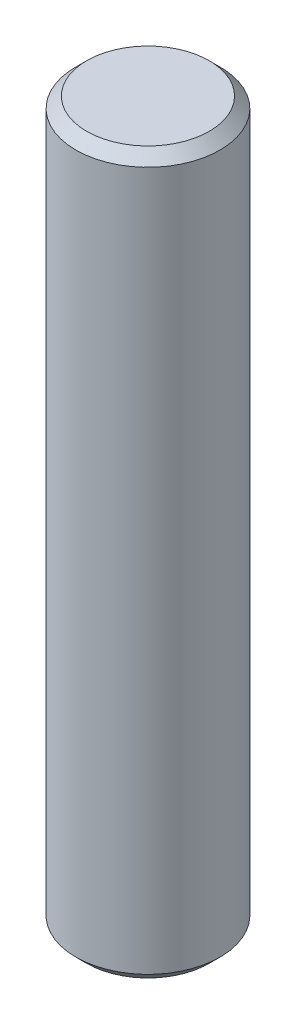
ISO-10303-21;
HEADER;
FILE_DESCRIPTION(('STEP AP214'),'2;1');
FILE_NAME('part.step','',(''),(''),'','','');
FILE_SCHEMA(('AUTOMOTIVE_DESIGN { 1 0 10303 214 1 1 1 1 }'));
ENDSEC;
DATA;
#1=APPLICATION_CONTEXT('core data for automotive mechanical design processes');
#2=APPLICATION_PROTOCOL_DEFINITION('international standard','automotive_design',2000,#1);
#3=PRODUCT_CONTEXT('',#1,'mechanical');
#4=PRODUCT('Part','Part','',(#3));
#5=PRODUCT_RELATED_PRODUCT_CATEGORY('part','',(#4));
#6=PRODUCT_DEFINITION_FORMATION('','',#4);
#7=PRODUCT_DEFINITION_CONTEXT('part definition',#1,'design');
#8=PRODUCT_DEFINITION('design','',#6,#7);
#9=PRODUCT_DEFINITION_SHAPE('','',#8);
#10=(LENGTH_UNIT() NAMED_UNIT(*) SI_UNIT(.MILLI.,.METRE.));
#11=(NAMED_UNIT(*) PLANE_ANGLE_UNIT() SI_UNIT($,.RADIAN.));
#12=(NAMED_UNIT(*) SI_UNIT($,.STERADIAN.) SOLID_ANGLE_UNIT());
#13=UNCERTAINTY_MEASURE_WITH_UNIT(LENGTH_MEASURE(1.E-05),#10,'distance_accuracy_value','');
#14=(GEOMETRIC_REPRESENTATION_CONTEXT(3) GLOBAL_UNCERTAINTY_ASSIGNED_CONTEXT((#13)) GLOBAL_UNIT_ASSIGNED_CONTEXT((#10,
#11,#12)) REPRESENTATION_CONTEXT('',''));
#15=CARTESIAN_POINT('',(0.,0.,0.));
#16=DIRECTION('',(0.,0.,1.));
#17=DIRECTION('',(1.,0.,0.));
#18=AXIS2_PLACEMENT_3D('',#15,#16,#17);
#19=CARTESIAN_POINT('',(0.,10.,0.));
#20=DIRECTION('',(0.,-1.,0.));
#21=DIRECTION('',(0.,0.,-1.));
#22=AXIS2_PLACEMENT_3D('',#19,#20,#21);
#23=CYLINDRICAL_SURFACE('',#22,2.);
#24=CARTESIAN_POINT('',(0.,-9.7,0.));
#25=DIRECTION('',(0.,1.,0.));
#26=DIRECTION('',(0.,0.,1.));
#27=AXIS2_PLACEMENT_3D('',#24,#25,#26);
#28=CIRCLE('',#27,2.);
#29=CARTESIAN_POINT('',(0.,-9.7,2.));
#30=VERTEX_POINT('',#29);
#31=EDGE_CURVE('E47',#30,#30,#28,.T.);
#32=ORIENTED_EDGE('',*,*,#31,.T.);
#33=EDGE_LOOP('',(#32));
#34=FACE_BOUND('',#33,.T.);
#35=CARTESIAN_POINT('',(0.,9.7,0.));
#36=DIRECTION('',(0.,1.,0.));
#37=DIRECTION('',(0.,0.,1.));
#38=AXIS2_PLACEMENT_3D('',#35,#36,#37);
#39=CIRCLE('',#38,2.);
#40=CARTESIAN_POINT('',(0.,9.7,2.));
#41=VERTEX_POINT('',#40);
#42=EDGE_CURVE('E51',#41,#41,#39,.F.);
#43=ORIENTED_EDGE('',*,*,#42,.T.);
#44=EDGE_LOOP('',(#43));
#45=FACE_BOUND('',#44,.T.);
#46=ADVANCED_FACE('F35',(#34,#45),#23,.T.);
#47=CARTESIAN_POINT('',(0.,10.,0.));
#48=DIRECTION('',(0.,1.,0.));
#49=DIRECTION('',(0.,0.,1.));
#50=AXIS2_PLACEMENT_3D('',#47,#48,#49);
#51=PLANE('',#50);
#52=CARTESIAN_POINT('',(0.,10.,0.));
#53=DIRECTION('',(0.,1.,0.));
#54=DIRECTION('',(0.,0.,1.));
#55=AXIS2_PLACEMENT_3D('',#52,#53,#54);
#56=CIRCLE('',#55,1.7);
#57=CARTESIAN_POINT('',(0.,10.,1.7));
#58=VERTEX_POINT('',#57);
#59=EDGE_CURVE('E10',#58,#58,#56,.T.);
#60=ORIENTED_EDGE('',*,*,#59,.T.);
#61=EDGE_LOOP('',(#60));
#62=FACE_BOUND('',#61,.T.);
#63=ADVANCED_FACE('F67',(#62),#51,.T.);
#64=CARTESIAN_POINT('',(0.,-10.,0.));
#65=DIRECTION('',(0.,1.,0.));
#66=DIRECTION('',(0.,0.,1.));
#67=AXIS2_PLACEMENT_3D('',#64,#65,#66);
#68=PLANE('',#67);
#69=CARTESIAN_POINT('',(0.,-10.,0.));
#70=DIRECTION('',(0.,1.,0.));
#71=DIRECTION('',(0.,0.,1.));
#72=AXIS2_PLACEMENT_3D('',#69,#70,#71);
#73=CIRCLE('',#72,1.7);
#74=CARTESIAN_POINT('',(0.,-10.,1.7));
#75=VERTEX_POINT('',#74);
#76=EDGE_CURVE('E43',#75,#75,#73,.F.);
#77=ORIENTED_EDGE('',*,*,#76,.T.);
#78=EDGE_LOOP('',(#77));
#79=FACE_BOUND('',#78,.T.);
#80=ADVANCED_FACE('F64',(#79),#68,.F.);
#81=CARTESIAN_POINT('',(0.,-9.7,0.));
#82=DIRECTION('',(0.,1.,0.));
#83=DIRECTION('',(0.,0.,1.));
#84=AXIS2_PLACEMENT_3D('',#81,#82,#83);
#85=CONICAL_SURFACE('',#84,2.,0.785398163397457);
#86=ORIENTED_EDGE('',*,*,#76,.F.);
#87=EDGE_LOOP('',(#86));
#88=FACE_BOUND('',#87,.T.);
#89=ORIENTED_EDGE('',*,*,#31,.F.);
#90=EDGE_LOOP('',(#89));
#91=FACE_BOUND('',#90,.T.);
#92=ADVANCED_FACE('F60',(#88,#91),#85,.T.);
#93=CARTESIAN_POINT('',(0.,10.,0.));
#94=DIRECTION('',(0.,-1.,0.));
#95=DIRECTION('',(0.,0.,-1.));
#96=AXIS2_PLACEMENT_3D('',#93,#94,#95);
#97=CONICAL_SURFACE('',#96,1.7,0.785398163397445);
#98=ORIENTED_EDGE('',*,*,#42,.F.);
#99=EDGE_LOOP('',(#98));
#100=FACE_BOUND('',#99,.T.);
#101=ORIENTED_EDGE('',*,*,#59,.F.);
#102=EDGE_LOOP('',(#101));
#103=FACE_BOUND('',#102,.T.);
#104=ADVANCED_FACE('F38',(#100,#103),#97,.T.);
#105=CLOSED_SHELL('',(#46,#63,#80,#92,#104));
#106=MANIFOLD_SOLID_BREP('B2',#105);
#107=ADVANCED_BREP_SHAPE_REPRESENTATION('',(#18,#106),#14);
#108=SHAPE_DEFINITION_REPRESENTATION(#9,#107);
ENDSEC;
END-ISO-10303-21;
